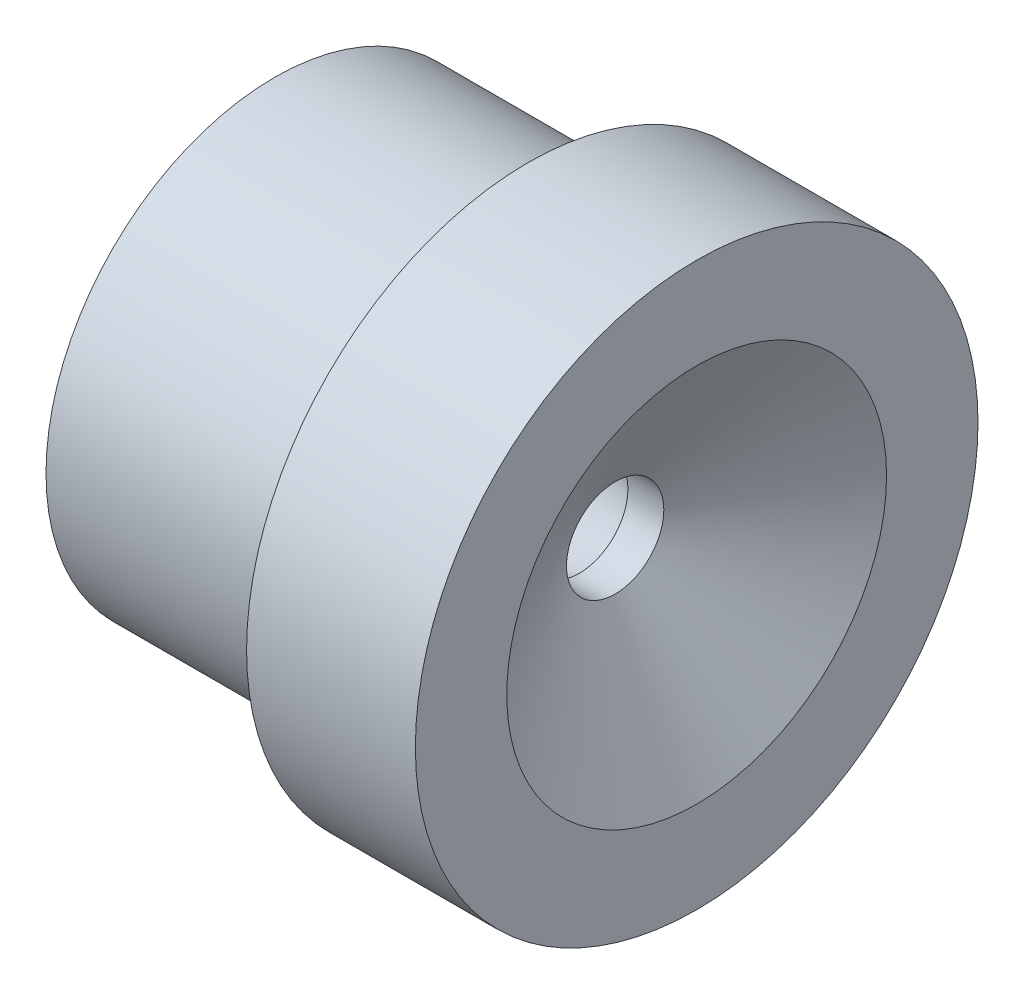
ISO-10303-21;
HEADER;
FILE_DESCRIPTION(('STEP AP214'),'2;1');
FILE_NAME('part.step','',(''),(''),'','','');
FILE_SCHEMA(('AUTOMOTIVE_DESIGN { 1 0 10303 214 1 1 1 1 }'));
ENDSEC;
DATA;
#1=APPLICATION_CONTEXT('core data for automotive mechanical design processes');
#2=APPLICATION_PROTOCOL_DEFINITION('international standard','automotive_design',2000,#1);
#3=PRODUCT_CONTEXT('',#1,'mechanical');
#4=PRODUCT('Part','Part','',(#3));
#5=PRODUCT_RELATED_PRODUCT_CATEGORY('part','',(#4));
#6=PRODUCT_DEFINITION_FORMATION('','',#4);
#7=PRODUCT_DEFINITION_CONTEXT('part definition',#1,'design');
#8=PRODUCT_DEFINITION('design','',#6,#7);
#9=PRODUCT_DEFINITION_SHAPE('','',#8);
#10=(LENGTH_UNIT() NAMED_UNIT(*) SI_UNIT(.MILLI.,.METRE.));
#11=(NAMED_UNIT(*) PLANE_ANGLE_UNIT() SI_UNIT($,.RADIAN.));
#12=(NAMED_UNIT(*) SI_UNIT($,.STERADIAN.) SOLID_ANGLE_UNIT());
#13=UNCERTAINTY_MEASURE_WITH_UNIT(LENGTH_MEASURE(1.E-05),#10,'distance_accuracy_value','');
#14=(GEOMETRIC_REPRESENTATION_CONTEXT(3) GLOBAL_UNCERTAINTY_ASSIGNED_CONTEXT((#13)) GLOBAL_UNIT_ASSIGNED_CONTEXT((#10,
#11,#12)) REPRESENTATION_CONTEXT('',''));
#15=CARTESIAN_POINT('',(0.,0.,0.));
#16=DIRECTION('',(0.,0.,1.));
#17=DIRECTION('',(1.,0.,0.));
#18=AXIS2_PLACEMENT_3D('',#15,#16,#17);
#19=CARTESIAN_POINT('',(5.11872970120267,0.,-12.7));
#20=DIRECTION('',(1.,0.,0.));
#21=DIRECTION('',(0.,0.,-1.));
#22=AXIS2_PLACEMENT_3D('',#19,#20,#21);
#23=CYLINDRICAL_SURFACE('',#22,12.7);
#24=CARTESIAN_POINT('',(0.,0.,-12.7));
#25=DIRECTION('',(1.,0.,0.));
#26=DIRECTION('',(0.,0.,-1.));
#27=AXIS2_PLACEMENT_3D('',#24,#25,#26);
#28=CIRCLE('',#27,12.7);
#29=CARTESIAN_POINT('',(0.,0.,-25.4));
#30=VERTEX_POINT('',#29);
#31=EDGE_CURVE('E11',#30,#30,#28,.T.);
#32=ORIENTED_EDGE('',*,*,#31,.F.);
#33=EDGE_LOOP('',(#32));
#34=FACE_BOUND('',#33,.T.);
#35=CARTESIAN_POINT('',(-7.62,0.,-12.7));
#36=DIRECTION('',(1.,0.,0.));
#37=DIRECTION('',(0.,0.,-1.));
#38=AXIS2_PLACEMENT_3D('',#35,#36,#37);
#39=CIRCLE('',#38,12.7);
#40=CARTESIAN_POINT('',(-7.62000000000001,0.,-25.4));
#41=VERTEX_POINT('',#40);
#42=EDGE_CURVE('E141',#41,#41,#39,.T.);
#43=ORIENTED_EDGE('',*,*,#42,.T.);
#44=EDGE_LOOP('',(#43));
#45=FACE_BOUND('',#44,.T.);
#46=ADVANCED_FACE('F106',(#34,#45),#23,.T.);
#47=CARTESIAN_POINT('',(0.,0.,0.));
#48=DIRECTION('',(-1.,0.,0.));
#49=DIRECTION('',(0.,0.,1.));
#50=AXIS2_PLACEMENT_3D('',#47,#48,#49);
#51=PLANE('',#50);
#52=CARTESIAN_POINT('',(0.,0.,-12.7));
#53=DIRECTION('',(1.,0.,0.));
#54=DIRECTION('',(0.,0.,-1.));
#55=AXIS2_PLACEMENT_3D('',#52,#53,#54);
#56=CIRCLE('',#55,8.5725);
#57=CARTESIAN_POINT('',(0.,0.,-21.2725));
#58=VERTEX_POINT('',#57);
#59=EDGE_CURVE('E114',#58,#58,#56,.T.);
#60=ORIENTED_EDGE('',*,*,#59,.F.);
#61=EDGE_LOOP('',(#60));
#62=FACE_BOUND('',#61,.T.);
#63=ORIENTED_EDGE('',*,*,#31,.T.);
#64=EDGE_LOOP('',(#63));
#65=FACE_BOUND('',#64,.T.);
#66=ADVANCED_FACE('F185',(#62,#65),#51,.F.);
#67=CARTESIAN_POINT('',(0.,0.,-12.7));
#68=DIRECTION('',(1.,0.,0.));
#69=DIRECTION('',(0.,0.,-1.));
#70=AXIS2_PLACEMENT_3D('',#67,#68,#69);
#71=CONICAL_SURFACE('',#70,8.5725,1.0471975511966);
#72=CARTESIAN_POINT('',(-3.68083890619152,0.,-12.7));
#73=DIRECTION('',(1.,0.,0.));
#74=DIRECTION('',(0.,0.,-1.));
#75=AXIS2_PLACEMENT_3D('',#72,#73,#74);
#76=CIRCLE('',#75,2.1971);
#77=CARTESIAN_POINT('',(-3.68083890619152,0.,-14.8971));
#78=VERTEX_POINT('',#77);
#79=EDGE_CURVE('E118',#78,#78,#76,.T.);
#80=CARTESIAN_POINT('',(-3.68083890619152,0.,-14.8971));
#81=CARTESIAN_POINT('',(-3.64249683425203,0.,-14.9635104166667));
#82=CARTESIAN_POINT('',(-3.60415476231253,0.,-15.0299208333333));
#83=CARTESIAN_POINT('',(-3.52747061843354,0.,-15.1627416666667));
#84=CARTESIAN_POINT('',(-3.48912854649405,0.,-15.2291520833333));
#85=CARTESIAN_POINT('',(-3.41244440261506,0.,-15.3619729166667));
#86=CARTESIAN_POINT('',(-3.37410233067556,0.,-15.4283833333333));
#87=CARTESIAN_POINT('',(-3.29741818679657,0.,-15.5612041666667));
#88=CARTESIAN_POINT('',(-3.25907611485708,0.,-15.6276145833333));
#89=CARTESIAN_POINT('',(-3.18239197097809,0.,-15.7604354166667));
#90=CARTESIAN_POINT('',(-3.14404989903859,0.,-15.8268458333333));
#91=CARTESIAN_POINT('',(-3.0673657551596,0.,-15.9596666666667));
#92=CARTESIAN_POINT('',(-3.02902368322011,0.,-16.0260770833333));
#93=CARTESIAN_POINT('',(-2.95233953934112,0.,-16.1588979166667));
#94=CARTESIAN_POINT('',(-2.91399746740162,0.,-16.2253083333333));
#95=CARTESIAN_POINT('',(-2.83731332352263,0.,-16.3581291666667));
#96=CARTESIAN_POINT('',(-2.79897125158314,0.,-16.4245395833333));
#97=CARTESIAN_POINT('',(-2.72228710770415,0.,-16.5573604166667));
#98=CARTESIAN_POINT('',(-2.68394503576465,0.,-16.6237708333333));
#99=CARTESIAN_POINT('',(-2.60726089188566,0.,-16.7565916666667));
#100=CARTESIAN_POINT('',(-2.56891881994617,0.,-16.8230020833333));
#101=CARTESIAN_POINT('',(-2.49223467606718,0.,-16.9558229166667));
#102=CARTESIAN_POINT('',(-2.45389260412768,0.,-17.0222333333333));
#103=CARTESIAN_POINT('',(-2.37720846024869,0.,-17.1550541666667));
#104=CARTESIAN_POINT('',(-2.3388663883092,0.,-17.2214645833333));
#105=CARTESIAN_POINT('',(-2.26218224443021,0.,-17.3542854166667));
#106=CARTESIAN_POINT('',(-2.22384017249071,0.,-17.4206958333333));
#107=CARTESIAN_POINT('',(-2.14715602861172,0.,-17.5535166666667));
#108=CARTESIAN_POINT('',(-2.10881395667223,0.,-17.6199270833333));
#109=CARTESIAN_POINT('',(-2.03212981279324,0.,-17.7527479166667));
#110=CARTESIAN_POINT('',(-1.99378774085374,0.,-17.8191583333333));
#111=CARTESIAN_POINT('',(-1.91710359697475,0.,-17.9519791666667));
#112=CARTESIAN_POINT('',(-1.87876152503526,0.,-18.0183895833333));
#113=CARTESIAN_POINT('',(-1.80207738115627,0.,-18.1512104166667));
#114=CARTESIAN_POINT('',(-1.76373530921677,0.,-18.2176208333333));
#115=CARTESIAN_POINT('',(-1.68705116533778,0.,-18.3504416666667));
#116=CARTESIAN_POINT('',(-1.64870909339829,0.,-18.4168520833333));
#117=CARTESIAN_POINT('',(-1.5720249495193,0.,-18.5496729166667));
#118=CARTESIAN_POINT('',(-1.5336828775798,0.,-18.6160833333333));
#119=CARTESIAN_POINT('',(-1.45699873370081,0.,-18.7489041666667));
#120=CARTESIAN_POINT('',(-1.41865666176132,0.,-18.8153145833333));
#121=CARTESIAN_POINT('',(-1.34197251788233,0.,-18.9481354166667));
#122=CARTESIAN_POINT('',(-1.30363044594283,0.,-19.0145458333333));
#123=CARTESIAN_POINT('',(-1.22694630206384,0.,-19.1473666666667));
#124=CARTESIAN_POINT('',(-1.18860423012435,0.,-19.2137770833333));
#125=CARTESIAN_POINT('',(-1.11192008624536,0.,-19.3465979166667));
#126=CARTESIAN_POINT('',(-1.07357801430586,0.,-19.4130083333333));
#127=CARTESIAN_POINT('',(-0.996893870426875,0.,-19.5458291666667));
#128=CARTESIAN_POINT('',(-0.95855179848738,0.,-19.6122395833333));
#129=CARTESIAN_POINT('',(-0.88186765460839,0.,-19.7450604166667));
#130=CARTESIAN_POINT('',(-0.843525582668895,0.,-19.8114708333333));
#131=CARTESIAN_POINT('',(-0.766841438789905,0.,-19.9442916666667));
#132=CARTESIAN_POINT('',(-0.728499366850411,0.,-20.0107020833333));
#133=CARTESIAN_POINT('',(-0.65181522297142,0.,-20.1435229166667));
#134=CARTESIAN_POINT('',(-0.613473151031925,0.,-20.2099333333333));
#135=CARTESIAN_POINT('',(-0.536789007152935,0.,-20.3427541666667));
#136=CARTESIAN_POINT('',(-0.49844693521344,0.,-20.4091645833333));
#137=CARTESIAN_POINT('',(-0.42176279133445,0.,-20.5419854166667));
#138=CARTESIAN_POINT('',(-0.383420719394955,0.,-20.6083958333333));
#139=CARTESIAN_POINT('',(-0.306736575515965,0.,-20.7412166666667));
#140=CARTESIAN_POINT('',(-0.26839450357647,0.,-20.8076270833333));
#141=CARTESIAN_POINT('',(-0.19171035969748,0.,-20.9404479166667));
#142=CARTESIAN_POINT('',(-0.153368287757985,0.,-21.0068583333333));
#143=CARTESIAN_POINT('',(-0.0766841438789952,0.,-21.1396791666667));
#144=CARTESIAN_POINT('',(-0.0383420719395003,0.,-21.2060895833333));
#145=CARTESIAN_POINT('',(0.,0.,-21.2725));
#146=B_SPLINE_CURVE_WITH_KNOTS('',3,(#80,#81,#82,#83,#84,#85,#86,#87,#88,#89,#90,#91,#92,#93,
#94,#95,#96,#97,#98,#99,#100,#101,#102,#103,#104,#105,#106,#107,#108,#109,#110,#111,#112,#113,
#114,#115,#116,#117,#118,#119,#120,#121,#122,#123,#124,#125,#126,#127,#128,#129,#130,#131,#132,
#133,#134,#135,#136,#137,#138,#139,#140,#141,#142,#143,#144,#145),.UNSPECIFIED.,.F.,.F.,(4,2,2,
2,2,2,2,2,2,2,2,2,2,2,2,2,2,2,2,2,2,2,2,2,2,2,2,2,2,2,2,2,4),(0.,0.230052431636972,
0.460104863273942,0.690157294910912,0.920209726547886,1.15026215818486,1.38031458982183,
1.6103670214588,1.84041945309577,2.07047188473274,2.30052431636971,2.53057674800668,
2.76062917964365,2.99068161128062,3.22073404291759,3.45078647455456,3.68083890619154,
3.91089133782851,4.14094376946548,4.37099620110245,4.60104863273942,4.83110106437639,
5.06115349601336,5.29120592765033,5.5212583592873,5.75131079092427,5.98136322256125,
6.21141565419822,6.44146808583519,6.67152051747216,6.90157294910913,7.1316253807461,
7.36167781238307),.UNSPECIFIED.);
#147=EDGE_CURVE('BSEAM180',#78,#58,#146,.T.);
#148=ORIENTED_EDGE('',*,*,#79,.F.);
#149=ORIENTED_EDGE('',*,*,#59,.T.);
#150=ORIENTED_EDGE('',*,*,#147,.T.);
#151=ORIENTED_EDGE('',*,*,#147,.F.);
#152=EDGE_LOOP('',(#148,#150,#149,#151));
#153=FACE_BOUND('',#152,.T.);
#154=ADVANCED_FACE('F180',(#153),#71,.F.);
#155=CARTESIAN_POINT('',(5.11872970120267,0.,-12.7));
#156=DIRECTION('',(1.,0.,0.));
#157=DIRECTION('',(0.,0.,-1.));
#158=AXIS2_PLACEMENT_3D('',#155,#156,#157);
#159=CYLINDRICAL_SURFACE('',#158,2.1971);
#160=CARTESIAN_POINT('',(-5.30135890619152,0.,-12.7));
#161=DIRECTION('',(1.,0.,0.));
#162=DIRECTION('',(0.,0.,-1.));
#163=AXIS2_PLACEMENT_3D('',#160,#161,#162);
#164=CIRCLE('',#163,2.1971);
#165=CARTESIAN_POINT('',(-5.30135890619152,0.,-14.8971));
#166=VERTEX_POINT('',#165);
#167=EDGE_CURVE('E123',#166,#166,#164,.T.);
#168=ORIENTED_EDGE('',*,*,#167,.F.);
#169=EDGE_LOOP('',(#168));
#170=FACE_BOUND('',#169,.T.);
#171=ORIENTED_EDGE('',*,*,#79,.T.);
#172=EDGE_LOOP('',(#171));
#173=FACE_BOUND('',#172,.T.);
#174=ADVANCED_FACE('F171',(#170,#173),#159,.F.);
#175=CARTESIAN_POINT('',(-5.30135890619152,0.,-12.7));
#176=DIRECTION('',(-1.,0.,0.));
#177=DIRECTION('',(0.,0.,1.));
#178=AXIS2_PLACEMENT_3D('',#175,#176,#177);
#179=CONICAL_SURFACE('',#178,2.1971,0.26179938779915);
#180=CARTESIAN_POINT('',(-19.05,0.,-12.7));
#181=DIRECTION('',(1.,0.,0.));
#182=DIRECTION('',(0.,0.,-1.));
#183=AXIS2_PLACEMENT_3D('',#180,#181,#182);
#184=CIRCLE('',#183,5.88103727811134);
#185=CARTESIAN_POINT('',(-19.05,0.,-18.5810372781113));
#186=VERTEX_POINT('',#185);
#187=EDGE_CURVE('E131',#186,#186,#184,.T.);
#188=ORIENTED_EDGE('',*,*,#187,.F.);
#189=EDGE_LOOP('',(#188));
#190=FACE_BOUND('',#189,.T.);
#191=ORIENTED_EDGE('',*,*,#167,.T.);
#192=EDGE_LOOP('',(#191));
#193=FACE_BOUND('',#192,.T.);
#194=ADVANCED_FACE('F164',(#190,#193),#179,.F.);
#195=CARTESIAN_POINT('',(-19.05,0.,-6.81896272188866));
#196=DIRECTION('',(1.,0.,0.));
#197=DIRECTION('',(0.,0.,-1.));
#198=AXIS2_PLACEMENT_3D('',#195,#196,#197);
#199=PLANE('',#198);
#200=CARTESIAN_POINT('',(-19.05,0.,-12.7));
#201=DIRECTION('',(1.,0.,0.));
#202=DIRECTION('',(0.,0.,-1.));
#203=AXIS2_PLACEMENT_3D('',#200,#201,#202);
#204=CIRCLE('',#203,10.3251);
#205=CARTESIAN_POINT('',(-19.05,0.,-23.0251));
#206=VERTEX_POINT('',#205);
#207=EDGE_CURVE('E134',#206,#206,#204,.T.);
#208=ORIENTED_EDGE('',*,*,#207,.F.);
#209=EDGE_LOOP('',(#208));
#210=FACE_BOUND('',#209,.T.);
#211=ORIENTED_EDGE('',*,*,#187,.T.);
#212=EDGE_LOOP('',(#211));
#213=FACE_BOUND('',#212,.T.);
#214=ADVANCED_FACE('F157',(#210,#213),#199,.F.);
#215=CARTESIAN_POINT('',(5.11872970120267,0.,-12.7));
#216=DIRECTION('',(1.,0.,0.));
#217=DIRECTION('',(0.,0.,-1.));
#218=AXIS2_PLACEMENT_3D('',#215,#216,#217);
#219=CYLINDRICAL_SURFACE('',#218,10.3251);
#220=CARTESIAN_POINT('',(-7.62,0.,-12.7));
#221=DIRECTION('',(1.,0.,0.));
#222=DIRECTION('',(0.,0.,-1.));
#223=AXIS2_PLACEMENT_3D('',#220,#221,#222);
#224=CIRCLE('',#223,10.3251);
#225=CARTESIAN_POINT('',(-7.62,0.,-23.0251));
#226=VERTEX_POINT('',#225);
#227=EDGE_CURVE('E136',#226,#226,#224,.T.);
#228=ORIENTED_EDGE('',*,*,#227,.F.);
#229=EDGE_LOOP('',(#228));
#230=FACE_BOUND('',#229,.T.);
#231=ORIENTED_EDGE('',*,*,#207,.T.);
#232=EDGE_LOOP('',(#231));
#233=FACE_BOUND('',#232,.T.);
#234=ADVANCED_FACE('F153',(#230,#233),#219,.T.);
#235=CARTESIAN_POINT('',(-7.62,0.,-2.3749));
#236=DIRECTION('',(1.,0.,0.));
#237=DIRECTION('',(0.,0.,-1.));
#238=AXIS2_PLACEMENT_3D('',#235,#236,#237);
#239=PLANE('',#238);
#240=ORIENTED_EDGE('',*,*,#42,.F.);
#241=EDGE_LOOP('',(#240));
#242=FACE_BOUND('',#241,.T.);
#243=ORIENTED_EDGE('',*,*,#227,.T.);
#244=EDGE_LOOP('',(#243));
#245=FACE_BOUND('',#244,.T.);
#246=ADVANCED_FACE('F147',(#242,#245),#239,.F.);
#247=CLOSED_SHELL('',(#46,#66,#154,#174,#194,#214,#234,#246));
#248=MANIFOLD_SOLID_BREP('B2',#247);
#249=ADVANCED_BREP_SHAPE_REPRESENTATION('',(#18,#248),#14);
#250=SHAPE_DEFINITION_REPRESENTATION(#9,#249);
ENDSEC;
END-ISO-10303-21;
